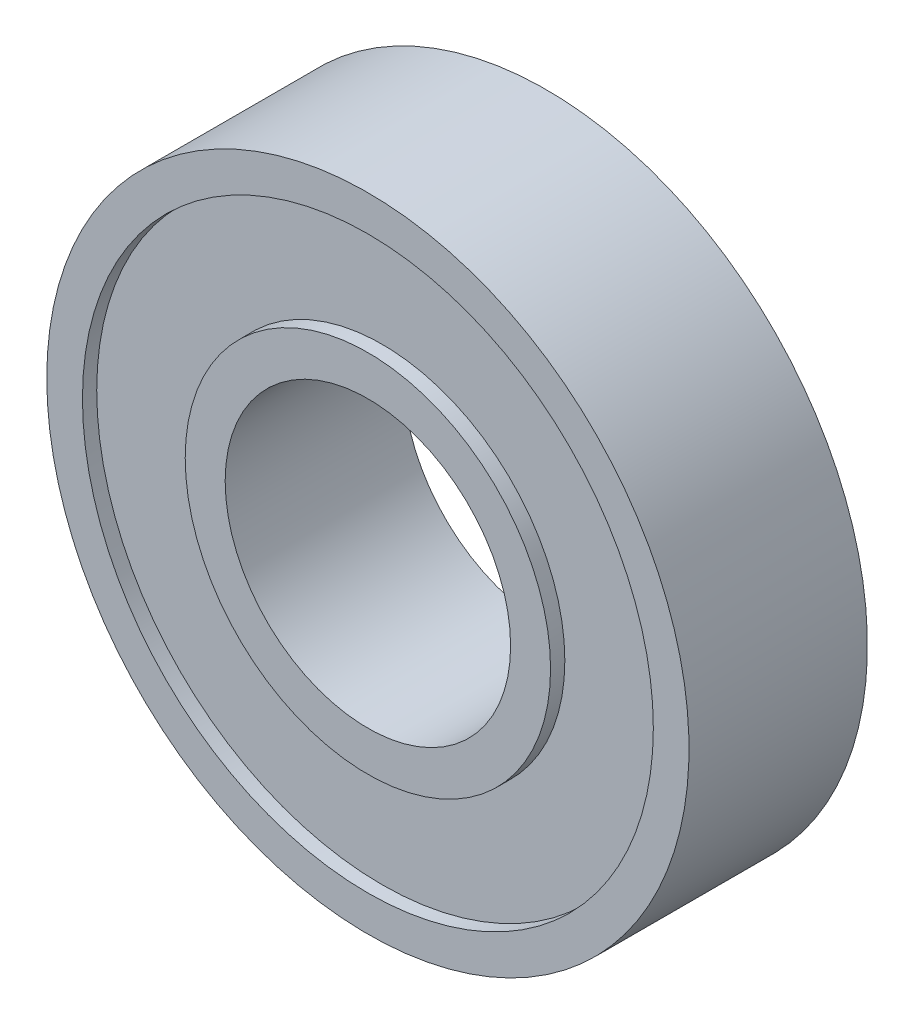
ISO-10303-21;
HEADER;
FILE_DESCRIPTION(('STEP AP214'),'2;1');
FILE_NAME('part.step','',(''),(''),'','','');
FILE_SCHEMA(('AUTOMOTIVE_DESIGN { 1 0 10303 214 1 1 1 1 }'));
ENDSEC;
DATA;
#1=APPLICATION_CONTEXT('core data for automotive mechanical design processes');
#2=APPLICATION_PROTOCOL_DEFINITION('international standard','automotive_design',2000,#1);
#3=PRODUCT_CONTEXT('',#1,'mechanical');
#4=PRODUCT('Part','Part','',(#3));
#5=PRODUCT_RELATED_PRODUCT_CATEGORY('part','',(#4));
#6=PRODUCT_DEFINITION_FORMATION('','',#4);
#7=PRODUCT_DEFINITION_CONTEXT('part definition',#1,'design');
#8=PRODUCT_DEFINITION('design','',#6,#7);
#9=PRODUCT_DEFINITION_SHAPE('','',#8);
#10=(LENGTH_UNIT() NAMED_UNIT(*) SI_UNIT(.MILLI.,.METRE.));
#11=(NAMED_UNIT(*) PLANE_ANGLE_UNIT() SI_UNIT($,.RADIAN.));
#12=(NAMED_UNIT(*) SI_UNIT($,.STERADIAN.) SOLID_ANGLE_UNIT());
#13=UNCERTAINTY_MEASURE_WITH_UNIT(LENGTH_MEASURE(1.E-05),#10,'distance_accuracy_value','');
#14=(GEOMETRIC_REPRESENTATION_CONTEXT(3) GLOBAL_UNCERTAINTY_ASSIGNED_CONTEXT((#13)) GLOBAL_UNIT_ASSIGNED_CONTEXT((#10,
#11,#12)) REPRESENTATION_CONTEXT('',''));
#15=CARTESIAN_POINT('',(0.,0.,0.));
#16=DIRECTION('',(0.,0.,1.));
#17=DIRECTION('',(1.,0.,0.));
#18=AXIS2_PLACEMENT_3D('',#15,#16,#17);
#19=CARTESIAN_POINT('',(0.,0.,-3.96875));
#20=DIRECTION('',(0.,0.,-1.));
#21=DIRECTION('',(-1.,0.,0.));
#22=AXIS2_PLACEMENT_3D('',#19,#20,#21);
#23=CYLINDRICAL_SURFACE('',#22,14.2875);
#24=CARTESIAN_POINT('',(0.,0.,3.96875));
#25=DIRECTION('',(0.,0.,-1.));
#26=DIRECTION('',(-1.,0.,0.));
#27=AXIS2_PLACEMENT_3D('',#24,#25,#26);
#28=CIRCLE('',#27,14.2875);
#29=CARTESIAN_POINT('',(-14.2875,0.,3.96875));
#30=VERTEX_POINT('',#29);
#31=EDGE_CURVE('E71',#30,#30,#28,.T.);
#32=ORIENTED_EDGE('',*,*,#31,.T.);
#33=EDGE_LOOP('',(#32));
#34=FACE_BOUND('',#33,.T.);
#35=CARTESIAN_POINT('',(0.,0.,-3.96875));
#36=DIRECTION('',(0.,0.,-1.));
#37=DIRECTION('',(-1.,0.,0.));
#38=AXIS2_PLACEMENT_3D('',#35,#36,#37);
#39=CIRCLE('',#38,14.2875);
#40=CARTESIAN_POINT('',(-14.2875,0.,-3.96875));
#41=VERTEX_POINT('',#40);
#42=EDGE_CURVE('E10',#41,#41,#39,.T.);
#43=ORIENTED_EDGE('',*,*,#42,.F.);
#44=EDGE_LOOP('',(#43));
#45=FACE_BOUND('',#44,.T.);
#46=ADVANCED_FACE('F31',(#34,#45),#23,.T.);
#47=CARTESIAN_POINT('',(1.44607864376269,0.,-3.96875));
#48=DIRECTION('',(0.,0.,1.));
#49=DIRECTION('',(1.,0.,0.));
#50=AXIS2_PLACEMENT_3D('',#47,#48,#49);
#51=PLANE('',#50);
#52=CARTESIAN_POINT('',(0.,0.,-3.96875));
#53=DIRECTION('',(0.,0.,-1.));
#54=DIRECTION('',(-1.,0.,0.));
#55=AXIS2_PLACEMENT_3D('',#52,#53,#54);
#56=CIRCLE('',#55,12.7);
#57=CARTESIAN_POINT('',(-12.7,0.,-3.96875));
#58=VERTEX_POINT('',#57);
#59=EDGE_CURVE('E37',#58,#58,#56,.T.);
#60=ORIENTED_EDGE('',*,*,#59,.F.);
#61=EDGE_LOOP('',(#60));
#62=FACE_BOUND('',#61,.T.);
#63=ORIENTED_EDGE('',*,*,#42,.T.);
#64=EDGE_LOOP('',(#63));
#65=FACE_BOUND('',#64,.T.);
#66=ADVANCED_FACE('F133',(#62,#65),#51,.F.);
#67=CARTESIAN_POINT('',(0.,0.,-3.96875));
#68=DIRECTION('',(0.,0.,-1.));
#69=DIRECTION('',(-1.,0.,0.));
#70=AXIS2_PLACEMENT_3D('',#67,#68,#69);
#71=CYLINDRICAL_SURFACE('',#70,12.7);
#72=CARTESIAN_POINT('',(0.,0.,-3.33375));
#73=DIRECTION('',(0.,0.,-1.));
#74=DIRECTION('',(-1.,0.,0.));
#75=AXIS2_PLACEMENT_3D('',#72,#73,#74);
#76=CIRCLE('',#75,12.7);
#77=CARTESIAN_POINT('',(-12.7,0.,-3.33375));
#78=VERTEX_POINT('',#77);
#79=EDGE_CURVE('E41',#78,#78,#76,.T.);
#80=ORIENTED_EDGE('',*,*,#79,.F.);
#81=EDGE_LOOP('',(#80));
#82=FACE_BOUND('',#81,.T.);
#83=ORIENTED_EDGE('',*,*,#59,.T.);
#84=EDGE_LOOP('',(#83));
#85=FACE_BOUND('',#84,.T.);
#86=ADVANCED_FACE('F128',(#82,#85),#71,.F.);
#87=CARTESIAN_POINT('',(1.44607864376269,0.,-3.33375));
#88=DIRECTION('',(0.,0.,1.));
#89=DIRECTION('',(1.,0.,0.));
#90=AXIS2_PLACEMENT_3D('',#87,#88,#89);
#91=PLANE('',#90);
#92=CARTESIAN_POINT('',(0.,0.,-3.33375));
#93=DIRECTION('',(0.,0.,-1.));
#94=DIRECTION('',(-1.,0.,0.));
#95=AXIS2_PLACEMENT_3D('',#92,#93,#94);
#96=CIRCLE('',#95,8.128);
#97=CARTESIAN_POINT('',(-8.128,0.,-3.33375));
#98=VERTEX_POINT('',#97);
#99=EDGE_CURVE('E45',#98,#98,#96,.T.);
#100=ORIENTED_EDGE('',*,*,#99,.F.);
#101=EDGE_LOOP('',(#100));
#102=FACE_BOUND('',#101,.T.);
#103=ORIENTED_EDGE('',*,*,#79,.T.);
#104=EDGE_LOOP('',(#103));
#105=FACE_BOUND('',#104,.T.);
#106=ADVANCED_FACE('F122',(#102,#105),#91,.F.);
#107=CARTESIAN_POINT('',(0.,0.,-3.96875));
#108=DIRECTION('',(0.,0.,-1.));
#109=DIRECTION('',(-1.,0.,0.));
#110=AXIS2_PLACEMENT_3D('',#107,#108,#109);
#111=CYLINDRICAL_SURFACE('',#110,8.128);
#112=CARTESIAN_POINT('',(0.,0.,-3.96875));
#113=DIRECTION('',(0.,0.,-1.));
#114=DIRECTION('',(-1.,0.,0.));
#115=AXIS2_PLACEMENT_3D('',#112,#113,#114);
#116=CIRCLE('',#115,8.128);
#117=CARTESIAN_POINT('',(-8.128,0.,-3.96875));
#118=VERTEX_POINT('',#117);
#119=EDGE_CURVE('E50',#118,#118,#116,.T.);
#120=ORIENTED_EDGE('',*,*,#119,.F.);
#121=EDGE_LOOP('',(#120));
#122=FACE_BOUND('',#121,.T.);
#123=ORIENTED_EDGE('',*,*,#99,.T.);
#124=EDGE_LOOP('',(#123));
#125=FACE_BOUND('',#124,.T.);
#126=ADVANCED_FACE('F116',(#122,#125),#111,.T.);
#127=CARTESIAN_POINT('',(1.44607864376269,0.,-3.96875));
#128=DIRECTION('',(0.,0.,1.));
#129=DIRECTION('',(1.,0.,0.));
#130=AXIS2_PLACEMENT_3D('',#127,#128,#129);
#131=PLANE('',#130);
#132=CARTESIAN_POINT('',(0.,0.,-3.96875));
#133=DIRECTION('',(0.,0.,-1.));
#134=DIRECTION('',(-1.,0.,0.));
#135=AXIS2_PLACEMENT_3D('',#132,#133,#134);
#136=CIRCLE('',#135,6.35);
#137=CARTESIAN_POINT('',(-6.35,0.,-3.96875));
#138=VERTEX_POINT('',#137);
#139=EDGE_CURVE('E53',#138,#138,#136,.T.);
#140=ORIENTED_EDGE('',*,*,#139,.F.);
#141=EDGE_LOOP('',(#140));
#142=FACE_BOUND('',#141,.T.);
#143=ORIENTED_EDGE('',*,*,#119,.T.);
#144=EDGE_LOOP('',(#143));
#145=FACE_BOUND('',#144,.T.);
#146=ADVANCED_FACE('F110',(#142,#145),#131,.F.);
#147=CARTESIAN_POINT('',(0.,0.,-3.96875));
#148=DIRECTION('',(0.,0.,-1.));
#149=DIRECTION('',(-1.,0.,0.));
#150=AXIS2_PLACEMENT_3D('',#147,#148,#149);
#151=CYLINDRICAL_SURFACE('',#150,6.35);
#152=CARTESIAN_POINT('',(0.,0.,3.96875));
#153=DIRECTION('',(0.,0.,-1.));
#154=DIRECTION('',(-1.,0.,0.));
#155=AXIS2_PLACEMENT_3D('',#152,#153,#154);
#156=CIRCLE('',#155,6.35);
#157=CARTESIAN_POINT('',(-6.35,0.,3.96875));
#158=VERTEX_POINT('',#157);
#159=EDGE_CURVE('E56',#158,#158,#156,.T.);
#160=ORIENTED_EDGE('',*,*,#159,.F.);
#161=EDGE_LOOP('',(#160));
#162=FACE_BOUND('',#161,.T.);
#163=ORIENTED_EDGE('',*,*,#139,.T.);
#164=EDGE_LOOP('',(#163));
#165=FACE_BOUND('',#164,.T.);
#166=ADVANCED_FACE('F104',(#162,#165),#151,.F.);
#167=CARTESIAN_POINT('',(1.44607864376269,0.,3.96875));
#168=DIRECTION('',(0.,0.,-1.));
#169=DIRECTION('',(-1.,0.,0.));
#170=AXIS2_PLACEMENT_3D('',#167,#168,#169);
#171=PLANE('',#170);
#172=CARTESIAN_POINT('',(0.,0.,3.96875));
#173=DIRECTION('',(0.,0.,-1.));
#174=DIRECTION('',(-1.,0.,0.));
#175=AXIS2_PLACEMENT_3D('',#172,#173,#174);
#176=CIRCLE('',#175,8.128);
#177=CARTESIAN_POINT('',(-8.128,0.,3.96875));
#178=VERTEX_POINT('',#177);
#179=EDGE_CURVE('E59',#178,#178,#176,.T.);
#180=ORIENTED_EDGE('',*,*,#179,.F.);
#181=EDGE_LOOP('',(#180));
#182=FACE_BOUND('',#181,.T.);
#183=ORIENTED_EDGE('',*,*,#159,.T.);
#184=EDGE_LOOP('',(#183));
#185=FACE_BOUND('',#184,.T.);
#186=ADVANCED_FACE('F98',(#182,#185),#171,.F.);
#187=CARTESIAN_POINT('',(0.,0.,-3.96875));
#188=DIRECTION('',(0.,0.,-1.));
#189=DIRECTION('',(-1.,0.,0.));
#190=AXIS2_PLACEMENT_3D('',#187,#188,#189);
#191=CYLINDRICAL_SURFACE('',#190,8.128);
#192=CARTESIAN_POINT('',(0.,0.,3.33375));
#193=DIRECTION('',(0.,0.,-1.));
#194=DIRECTION('',(-1.,0.,0.));
#195=AXIS2_PLACEMENT_3D('',#192,#193,#194);
#196=CIRCLE('',#195,8.128);
#197=CARTESIAN_POINT('',(-8.128,0.,3.33375));
#198=VERTEX_POINT('',#197);
#199=EDGE_CURVE('E62',#198,#198,#196,.T.);
#200=ORIENTED_EDGE('',*,*,#199,.F.);
#201=EDGE_LOOP('',(#200));
#202=FACE_BOUND('',#201,.T.);
#203=ORIENTED_EDGE('',*,*,#179,.T.);
#204=EDGE_LOOP('',(#203));
#205=FACE_BOUND('',#204,.T.);
#206=ADVANCED_FACE('F92',(#202,#205),#191,.T.);
#207=CARTESIAN_POINT('',(1.44607864376269,0.,3.33375));
#208=DIRECTION('',(0.,0.,-1.));
#209=DIRECTION('',(-1.,0.,0.));
#210=AXIS2_PLACEMENT_3D('',#207,#208,#209);
#211=PLANE('',#210);
#212=CARTESIAN_POINT('',(0.,0.,3.33375));
#213=DIRECTION('',(0.,0.,-1.));
#214=DIRECTION('',(-1.,0.,0.));
#215=AXIS2_PLACEMENT_3D('',#212,#213,#214);
#216=CIRCLE('',#215,12.7);
#217=CARTESIAN_POINT('',(-12.7,0.,3.33375));
#218=VERTEX_POINT('',#217);
#219=EDGE_CURVE('E65',#218,#218,#216,.T.);
#220=ORIENTED_EDGE('',*,*,#219,.F.);
#221=EDGE_LOOP('',(#220));
#222=FACE_BOUND('',#221,.T.);
#223=ORIENTED_EDGE('',*,*,#199,.T.);
#224=EDGE_LOOP('',(#223));
#225=FACE_BOUND('',#224,.T.);
#226=ADVANCED_FACE('F86',(#222,#225),#211,.F.);
#227=CARTESIAN_POINT('',(0.,0.,-3.96875));
#228=DIRECTION('',(0.,0.,-1.));
#229=DIRECTION('',(-1.,0.,0.));
#230=AXIS2_PLACEMENT_3D('',#227,#228,#229);
#231=CYLINDRICAL_SURFACE('',#230,12.7);
#232=CARTESIAN_POINT('',(0.,0.,3.96875));
#233=DIRECTION('',(0.,0.,-1.));
#234=DIRECTION('',(-1.,0.,0.));
#235=AXIS2_PLACEMENT_3D('',#232,#233,#234);
#236=CIRCLE('',#235,12.7);
#237=CARTESIAN_POINT('',(-12.7,0.,3.96875));
#238=VERTEX_POINT('',#237);
#239=EDGE_CURVE('E68',#238,#238,#236,.T.);
#240=ORIENTED_EDGE('',*,*,#239,.F.);
#241=EDGE_LOOP('',(#240));
#242=FACE_BOUND('',#241,.T.);
#243=ORIENTED_EDGE('',*,*,#219,.T.);
#244=EDGE_LOOP('',(#243));
#245=FACE_BOUND('',#244,.T.);
#246=ADVANCED_FACE('F80',(#242,#245),#231,.F.);
#247=CARTESIAN_POINT('',(1.44607864376269,0.,3.96875));
#248=DIRECTION('',(0.,0.,-1.));
#249=DIRECTION('',(-1.,0.,0.));
#250=AXIS2_PLACEMENT_3D('',#247,#248,#249);
#251=PLANE('',#250);
#252=ORIENTED_EDGE('',*,*,#31,.F.);
#253=EDGE_LOOP('',(#252));
#254=FACE_BOUND('',#253,.T.);
#255=ORIENTED_EDGE('',*,*,#239,.T.);
#256=EDGE_LOOP('',(#255));
#257=FACE_BOUND('',#256,.T.);
#258=ADVANCED_FACE('F77',(#254,#257),#251,.F.);
#259=CLOSED_SHELL('',(#46,#66,#86,#106,#126,#146,#166,#186,#206,#226,#246,#258));
#260=MANIFOLD_SOLID_BREP('B2',#259);
#261=ADVANCED_BREP_SHAPE_REPRESENTATION('',(#18,#260),#14);
#262=SHAPE_DEFINITION_REPRESENTATION(#9,#261);
ENDSEC;
END-ISO-10303-21;
